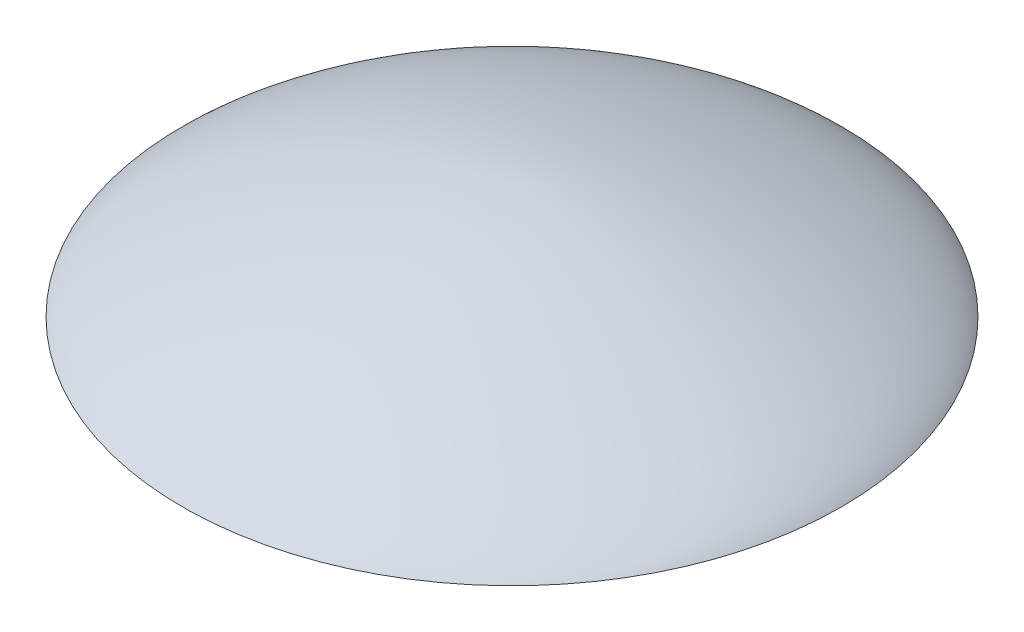
ISO-10303-21;
HEADER;
FILE_DESCRIPTION(('STEP AP214'),'2;1');
FILE_NAME('part.step','',(''),(''),'','','');
FILE_SCHEMA(('AUTOMOTIVE_DESIGN { 1 0 10303 214 1 1 1 1 }'));
ENDSEC;
DATA;
#1=APPLICATION_CONTEXT('core data for automotive mechanical design processes');
#2=APPLICATION_PROTOCOL_DEFINITION('international standard','automotive_design',2000,#1);
#3=PRODUCT_CONTEXT('',#1,'mechanical');
#4=PRODUCT('Part','Part','',(#3));
#5=PRODUCT_RELATED_PRODUCT_CATEGORY('part','',(#4));
#6=PRODUCT_DEFINITION_FORMATION('','',#4);
#7=PRODUCT_DEFINITION_CONTEXT('part definition',#1,'design');
#8=PRODUCT_DEFINITION('design','',#6,#7);
#9=PRODUCT_DEFINITION_SHAPE('','',#8);
#10=(LENGTH_UNIT() NAMED_UNIT(*) SI_UNIT(.MILLI.,.METRE.));
#11=(NAMED_UNIT(*) PLANE_ANGLE_UNIT() SI_UNIT($,.RADIAN.));
#12=(NAMED_UNIT(*) SI_UNIT($,.STERADIAN.) SOLID_ANGLE_UNIT());
#13=UNCERTAINTY_MEASURE_WITH_UNIT(LENGTH_MEASURE(1.E-05),#10,'distance_accuracy_value','');
#14=(GEOMETRIC_REPRESENTATION_CONTEXT(3) GLOBAL_UNCERTAINTY_ASSIGNED_CONTEXT((#13)) GLOBAL_UNIT_ASSIGNED_CONTEXT((#10,
#11,#12)) REPRESENTATION_CONTEXT('',''));
#15=CARTESIAN_POINT('',(0.,0.,0.));
#16=DIRECTION('',(0.,0.,1.));
#17=DIRECTION('',(1.,0.,0.));
#18=AXIS2_PLACEMENT_3D('',#15,#16,#17);
#19=CARTESIAN_POINT('',(0.,0.,0.));
#20=DIRECTION('',(0.,-1.,0.));
#21=DIRECTION('',(0.,0.,-1.));
#22=AXIS2_PLACEMENT_3D('',#19,#20,#21);
#23=PLANE('',#22);
#24=CARTESIAN_POINT('',(0.,0.,0.));
#25=DIRECTION('',(0.,-1.,0.));
#26=DIRECTION('',(0.,0.,-1.));
#27=AXIS2_PLACEMENT_3D('',#24,#25,#26);
#28=CIRCLE('',#27,67.5);
#29=CARTESIAN_POINT('',(0.,0.,-67.5));
#30=VERTEX_POINT('',#29);
#31=EDGE_CURVE('E11',#30,#30,#28,.T.);
#32=ORIENTED_EDGE('',*,*,#31,.T.);
#33=EDGE_LOOP('',(#32));
#34=FACE_BOUND('',#33,.T.);
#35=ADVANCED_FACE('F34',(#34),#23,.T.);
#36=CARTESIAN_POINT('',(67.5,0.,0.));
#37=CARTESIAN_POINT('',(60.008828159025,7.59161923806447,0.));
#38=CARTESIAN_POINT('',(21.0630542108786,21.7599728402173,0.));
#39=CARTESIAN_POINT('',(0.,20.7896716902111,0.));
#40=B_SPLINE_CURVE_WITH_KNOTS('',3,(#36,#37,#38,#39),.UNSPECIFIED.,.F.,.F.,(4,4),(0.,1.),.UNSPECIFIED.);
#41=CARTESIAN_POINT('',(0.,-93.1542056074767,0.));
#42=DIRECTION('',(0.,-1.,0.));
#43=AXIS1_PLACEMENT('',#41,#42);
#44=SURFACE_OF_REVOLUTION('',#40,#43);
#45=CARTESIAN_POINT('',(0.,20.7896716902111,0.));
#46=VERTEX_POINT('',#45);
#47=VERTEX_LOOP('',#46);
#48=FACE_BOUND('',#47,.T.);
#49=ORIENTED_EDGE('',*,*,#31,.F.);
#50=EDGE_LOOP('',(#49));
#51=FACE_BOUND('',#50,.T.);
#52=ADVANCED_FACE('F42',(#48,#51),#44,.F.);
#53=CLOSED_SHELL('',(#35,#52));
#54=MANIFOLD_SOLID_BREP('B2',#53);
#55=ADVANCED_BREP_SHAPE_REPRESENTATION('',(#18,#54),#14);
#56=SHAPE_DEFINITION_REPRESENTATION(#9,#55);
ENDSEC;
END-ISO-10303-21;
